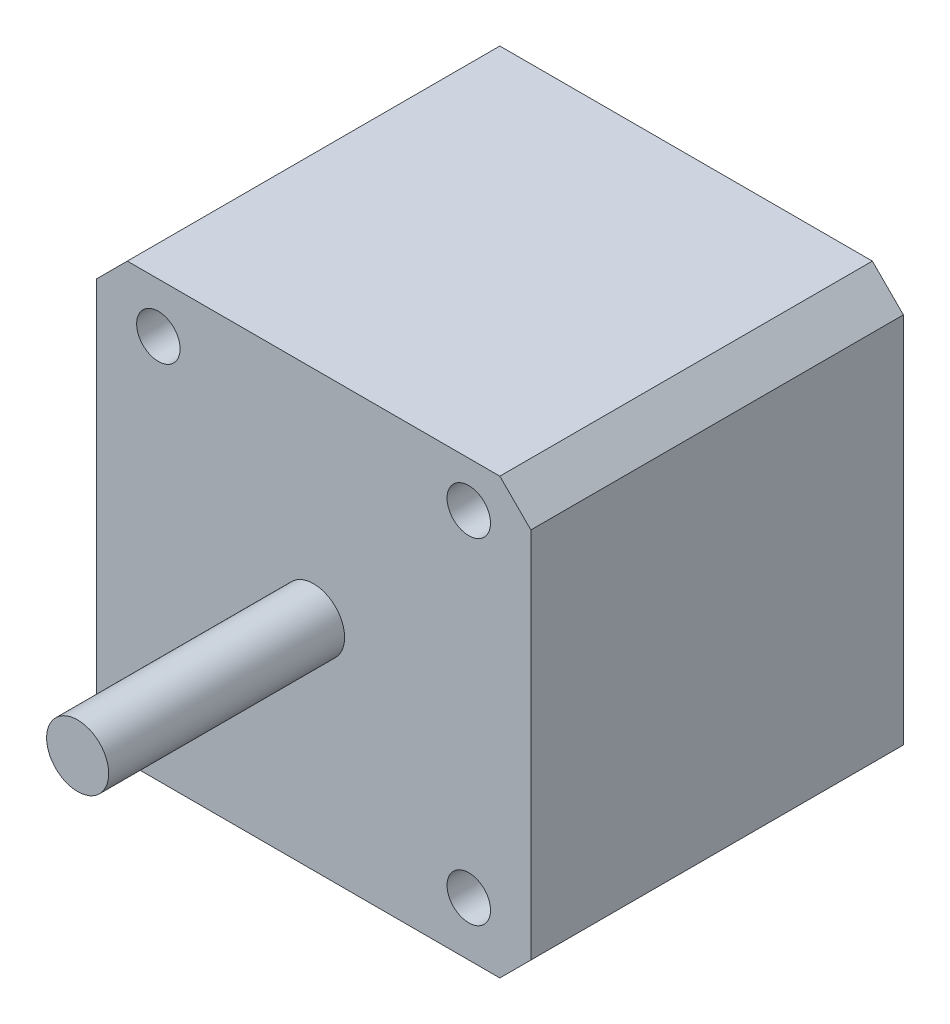
ISO-10303-21;
HEADER;
FILE_DESCRIPTION(('STEP AP214'),'2;1');
FILE_NAME('part.step','',(''),(''),'','','');
FILE_SCHEMA(('AUTOMOTIVE_DESIGN { 1 0 10303 214 1 1 1 1 }'));
ENDSEC;
DATA;
#1=APPLICATION_CONTEXT('core data for automotive mechanical design processes');
#2=APPLICATION_PROTOCOL_DEFINITION('international standard','automotive_design',2000,#1);
#3=PRODUCT_CONTEXT('',#1,'mechanical');
#4=PRODUCT('Part','Part','',(#3));
#5=PRODUCT_RELATED_PRODUCT_CATEGORY('part','',(#4));
#6=PRODUCT_DEFINITION_FORMATION('','',#4);
#7=PRODUCT_DEFINITION_CONTEXT('part definition',#1,'design');
#8=PRODUCT_DEFINITION('design','',#6,#7);
#9=PRODUCT_DEFINITION_SHAPE('','',#8);
#10=(LENGTH_UNIT() NAMED_UNIT(*) SI_UNIT(.MILLI.,.METRE.));
#11=(NAMED_UNIT(*) PLANE_ANGLE_UNIT() SI_UNIT($,.RADIAN.));
#12=(NAMED_UNIT(*) SI_UNIT($,.STERADIAN.) SOLID_ANGLE_UNIT());
#13=UNCERTAINTY_MEASURE_WITH_UNIT(LENGTH_MEASURE(1.E-05),#10,'distance_accuracy_value','');
#14=(GEOMETRIC_REPRESENTATION_CONTEXT(3) GLOBAL_UNCERTAINTY_ASSIGNED_CONTEXT((#13)) GLOBAL_UNIT_ASSIGNED_CONTEXT((#10,
#11,#12)) REPRESENTATION_CONTEXT('',''));
#15=CARTESIAN_POINT('',(0.,0.,0.));
#16=DIRECTION('',(0.,0.,1.));
#17=DIRECTION('',(1.,0.,0.));
#18=AXIS2_PLACEMENT_3D('',#15,#16,#17);
#19=CARTESIAN_POINT('',(17.5,17.5,49.));
#20=DIRECTION('',(0.,0.,1.));
#21=DIRECTION('',(1.,0.,0.));
#22=AXIS2_PLACEMENT_3D('',#19,#20,#21);
#23=PLANE('',#22);
#24=CARTESIAN_POINT('',(17.5,17.5,49.));
#25=DIRECTION('',(0.,0.,-1.));
#26=DIRECTION('',(-1.,0.,0.));
#27=AXIS2_PLACEMENT_3D('',#24,#25,#26);
#28=CIRCLE('',#27,2.5);
#29=CARTESIAN_POINT('',(15.,17.5,49.));
#30=VERTEX_POINT('',#29);
#31=EDGE_CURVE('E20',#30,#30,#28,.T.);
#32=ORIENTED_EDGE('',*,*,#31,.F.);
#33=EDGE_LOOP('',(#32));
#34=FACE_BOUND('',#33,.T.);
#35=ADVANCED_FACE('F17',(#34),#23,.T.);
#36=CARTESIAN_POINT('',(17.5,17.5,49.));
#37=DIRECTION('',(0.,0.,-1.));
#38=DIRECTION('',(-1.,0.,0.));
#39=AXIS2_PLACEMENT_3D('',#36,#37,#38);
#40=CYLINDRICAL_SURFACE('',#39,2.5);
#41=ORIENTED_EDGE('',*,*,#31,.T.);
#42=EDGE_LOOP('',(#41));
#43=FACE_BOUND('',#42,.T.);
#44=CARTESIAN_POINT('',(17.5,17.5,30.));
#45=DIRECTION('',(0.,0.,-1.));
#46=DIRECTION('',(-1.,0.,0.));
#47=AXIS2_PLACEMENT_3D('',#44,#45,#46);
#48=CIRCLE('',#47,2.5);
#49=CARTESIAN_POINT('',(15.,17.5,30.));
#50=VERTEX_POINT('',#49);
#51=EDGE_CURVE('E132',#50,#50,#48,.F.);
#52=ORIENTED_EDGE('',*,*,#51,.T.);
#53=EDGE_LOOP('',(#52));
#54=FACE_BOUND('',#53,.T.);
#55=ADVANCED_FACE('F139',(#43,#54),#40,.T.);
#56=CARTESIAN_POINT('',(0.,0.,30.));
#57=DIRECTION('',(0.,0.,-1.));
#58=DIRECTION('',(-1.,0.,0.));
#59=AXIS2_PLACEMENT_3D('',#56,#57,#58);
#60=PLANE('',#59);
#61=ORIENTED_EDGE('',*,*,#51,.F.);
#62=EDGE_LOOP('',(#61));
#63=FACE_BOUND('',#62,.T.);
#64=DIRECTION('',(-0.707106781186546,0.707106781186549,0.));
#65=VECTOR('',#64,1.);
#66=CARTESIAN_POINT('',(2.5,0.,30.));
#67=LINE('',#66,#65);
#68=CARTESIAN_POINT('',(0.,2.50000000000002,30.));
#69=VERTEX_POINT('',#68);
#70=CARTESIAN_POINT('',(2.5,0.,30.));
#71=VERTEX_POINT('',#70);
#72=EDGE_CURVE('E95',#69,#71,#67,.F.);
#73=ORIENTED_EDGE('',*,*,#72,.T.);
#74=DIRECTION('',(1.,0.,0.));
#75=VECTOR('',#74,1.);
#76=CARTESIAN_POINT('',(0.,0.,30.));
#77=LINE('',#76,#75);
#78=CARTESIAN_POINT('',(32.5,0.,30.));
#79=VERTEX_POINT('',#78);
#80=EDGE_CURVE('E84',#71,#79,#77,.T.);
#81=ORIENTED_EDGE('',*,*,#80,.T.);
#82=DIRECTION('',(-0.707106781186549,-0.707106781186546,0.));
#83=VECTOR('',#82,1.);
#84=CARTESIAN_POINT('',(35.,2.5,30.));
#85=LINE('',#84,#83);
#86=CARTESIAN_POINT('',(35.,2.50000000000001,30.));
#87=VERTEX_POINT('',#86);
#88=EDGE_CURVE('E121',#79,#87,#85,.F.);
#89=ORIENTED_EDGE('',*,*,#88,.T.);
#90=DIRECTION('',(0.,1.,0.));
#91=VECTOR('',#90,1.);
#92=CARTESIAN_POINT('',(35.,0.,30.));
#93=LINE('',#92,#91);
#94=CARTESIAN_POINT('',(35.,32.5,30.));
#95=VERTEX_POINT('',#94);
#96=EDGE_CURVE('E339',#87,#95,#93,.T.);
#97=ORIENTED_EDGE('',*,*,#96,.T.);
#98=DIRECTION('',(0.707106781186546,-0.707106781186549,0.));
#99=VECTOR('',#98,1.);
#100=CARTESIAN_POINT('',(32.5,35.,30.));
#101=LINE('',#100,#99);
#102=CARTESIAN_POINT('',(32.5,35.,30.));
#103=VERTEX_POINT('',#102);
#104=EDGE_CURVE('E334',#95,#103,#101,.F.);
#105=ORIENTED_EDGE('',*,*,#104,.T.);
#106=DIRECTION('',(1.,0.,0.));
#107=VECTOR('',#106,1.);
#108=CARTESIAN_POINT('',(0.,35.,30.));
#109=LINE('',#108,#107);
#110=CARTESIAN_POINT('',(2.50000000000002,35.,30.));
#111=VERTEX_POINT('',#110);
#112=EDGE_CURVE('E329',#103,#111,#109,.F.);
#113=ORIENTED_EDGE('',*,*,#112,.T.);
#114=DIRECTION('',(0.707106781186549,0.707106781186546,0.));
#115=VECTOR('',#114,1.);
#116=CARTESIAN_POINT('',(0.,32.5,30.));
#117=LINE('',#116,#115);
#118=CARTESIAN_POINT('',(0.,32.5,30.));
#119=VERTEX_POINT('',#118);
#120=EDGE_CURVE('E323',#111,#119,#117,.F.);
#121=ORIENTED_EDGE('',*,*,#120,.T.);
#122=DIRECTION('',(0.,1.,0.));
#123=VECTOR('',#122,1.);
#124=CARTESIAN_POINT('',(0.,0.,30.));
#125=LINE('',#124,#123);
#126=EDGE_CURVE('E79',#119,#69,#125,.F.);
#127=ORIENTED_EDGE('',*,*,#126,.T.);
#128=EDGE_LOOP('',(#73,#81,#89,#97,#105,#113,#121,#127));
#129=FACE_BOUND('',#128,.T.);
#130=CARTESIAN_POINT('',(4.99999999999999,4.,30.));
#131=DIRECTION('',(0.,0.,-1.));
#132=DIRECTION('',(-1.,0.,0.));
#133=AXIS2_PLACEMENT_3D('',#130,#131,#132);
#134=CIRCLE('',#133,1.75);
#135=CARTESIAN_POINT('',(3.24999999999999,4.,30.));
#136=VERTEX_POINT('',#135);
#137=EDGE_CURVE('E93',#136,#136,#134,.T.);
#138=ORIENTED_EDGE('',*,*,#137,.T.);
#139=EDGE_LOOP('',(#138));
#140=FACE_BOUND('',#139,.T.);
#141=CARTESIAN_POINT('',(30.,4.34590142974924,30.));
#142=DIRECTION('',(0.,0.,-1.));
#143=DIRECTION('',(-1.,0.,0.));
#144=AXIS2_PLACEMENT_3D('',#141,#142,#143);
#145=CIRCLE('',#144,1.75);
#146=CARTESIAN_POINT('',(28.25,4.34590142974924,30.));
#147=VERTEX_POINT('',#146);
#148=EDGE_CURVE('E124',#147,#147,#145,.T.);
#149=ORIENTED_EDGE('',*,*,#148,.T.);
#150=EDGE_LOOP('',(#149));
#151=FACE_BOUND('',#150,.T.);
#152=CARTESIAN_POINT('',(5.00000000000008,31.,30.));
#153=DIRECTION('',(0.,0.,-1.));
#154=DIRECTION('',(-1.,0.,0.));
#155=AXIS2_PLACEMENT_3D('',#152,#153,#154);
#156=CIRCLE('',#155,1.75);
#157=CARTESIAN_POINT('',(3.25000000000008,31.,30.));
#158=VERTEX_POINT('',#157);
#159=EDGE_CURVE('E127',#158,#158,#156,.T.);
#160=ORIENTED_EDGE('',*,*,#159,.T.);
#161=EDGE_LOOP('',(#160));
#162=FACE_BOUND('',#161,.T.);
#163=CARTESIAN_POINT('',(30.0000000000001,31.3459014297492,30.));
#164=DIRECTION('',(0.,0.,-1.));
#165=DIRECTION('',(-1.,0.,0.));
#166=AXIS2_PLACEMENT_3D('',#163,#164,#165);
#167=CIRCLE('',#166,1.75);
#168=CARTESIAN_POINT('',(28.2500000000001,31.3459014297492,30.));
#169=VERTEX_POINT('',#168);
#170=EDGE_CURVE('E130',#169,#169,#167,.T.);
#171=ORIENTED_EDGE('',*,*,#170,.T.);
#172=EDGE_LOOP('',(#171));
#173=FACE_BOUND('',#172,.T.);
#174=ADVANCED_FACE('F96',(#63,#129,#140,#151,#162,#173),#60,.F.);
#175=CARTESIAN_POINT('',(30.0000000000001,31.3459014297492,49.));
#176=DIRECTION('',(0.,0.,-1.));
#177=DIRECTION('',(-1.,0.,0.));
#178=AXIS2_PLACEMENT_3D('',#175,#176,#177);
#179=CYLINDRICAL_SURFACE('',#178,1.75);
#180=CARTESIAN_POINT('',(30.0000000000001,31.3459014297492,0.));
#181=DIRECTION('',(0.,0.,-1.));
#182=DIRECTION('',(-1.,0.,0.));
#183=AXIS2_PLACEMENT_3D('',#180,#181,#182);
#184=CIRCLE('',#183,1.75);
#185=CARTESIAN_POINT('',(28.2500000000001,31.3459014297492,0.));
#186=VERTEX_POINT('',#185);
#187=EDGE_CURVE('E118',#186,#186,#184,.F.);
#188=ORIENTED_EDGE('',*,*,#187,.F.);
#189=EDGE_LOOP('',(#188));
#190=FACE_BOUND('',#189,.T.);
#191=ORIENTED_EDGE('',*,*,#170,.F.);
#192=EDGE_LOOP('',(#191));
#193=FACE_BOUND('',#192,.T.);
#194=ADVANCED_FACE('F193',(#190,#193),#179,.F.);
#195=CARTESIAN_POINT('',(5.00000000000008,31.,49.));
#196=DIRECTION('',(0.,0.,-1.));
#197=DIRECTION('',(-1.,0.,0.));
#198=AXIS2_PLACEMENT_3D('',#195,#196,#197);
#199=CYLINDRICAL_SURFACE('',#198,1.75);
#200=CARTESIAN_POINT('',(5.00000000000008,31.,0.));
#201=DIRECTION('',(0.,0.,-1.));
#202=DIRECTION('',(-1.,0.,0.));
#203=AXIS2_PLACEMENT_3D('',#200,#201,#202);
#204=CIRCLE('',#203,1.75);
#205=CARTESIAN_POINT('',(3.25000000000008,31.,0.));
#206=VERTEX_POINT('',#205);
#207=EDGE_CURVE('E115',#206,#206,#204,.F.);
#208=ORIENTED_EDGE('',*,*,#207,.F.);
#209=EDGE_LOOP('',(#208));
#210=FACE_BOUND('',#209,.T.);
#211=ORIENTED_EDGE('',*,*,#159,.F.);
#212=EDGE_LOOP('',(#211));
#213=FACE_BOUND('',#212,.T.);
#214=ADVANCED_FACE('F189',(#210,#213),#199,.F.);
#215=CARTESIAN_POINT('',(30.,4.34590142974924,49.));
#216=DIRECTION('',(0.,0.,-1.));
#217=DIRECTION('',(-1.,0.,0.));
#218=AXIS2_PLACEMENT_3D('',#215,#216,#217);
#219=CYLINDRICAL_SURFACE('',#218,1.75);
#220=CARTESIAN_POINT('',(30.,4.34590142974924,0.));
#221=DIRECTION('',(0.,0.,-1.));
#222=DIRECTION('',(-1.,0.,0.));
#223=AXIS2_PLACEMENT_3D('',#220,#221,#222);
#224=CIRCLE('',#223,1.75);
#225=CARTESIAN_POINT('',(28.25,4.34590142974924,0.));
#226=VERTEX_POINT('',#225);
#227=EDGE_CURVE('E112',#226,#226,#224,.F.);
#228=ORIENTED_EDGE('',*,*,#227,.F.);
#229=EDGE_LOOP('',(#228));
#230=FACE_BOUND('',#229,.T.);
#231=ORIENTED_EDGE('',*,*,#148,.F.);
#232=EDGE_LOOP('',(#231));
#233=FACE_BOUND('',#232,.T.);
#234=ADVANCED_FACE('F185',(#230,#233),#219,.F.);
#235=CARTESIAN_POINT('',(4.99999999999999,4.,49.));
#236=DIRECTION('',(0.,0.,-1.));
#237=DIRECTION('',(-1.,0.,0.));
#238=AXIS2_PLACEMENT_3D('',#235,#236,#237);
#239=CYLINDRICAL_SURFACE('',#238,1.75);
#240=CARTESIAN_POINT('',(4.99999999999999,4.,0.));
#241=DIRECTION('',(0.,0.,-1.));
#242=DIRECTION('',(-1.,0.,0.));
#243=AXIS2_PLACEMENT_3D('',#240,#241,#242);
#244=CIRCLE('',#243,1.75);
#245=CARTESIAN_POINT('',(3.24999999999999,4.,0.));
#246=VERTEX_POINT('',#245);
#247=EDGE_CURVE('E108',#246,#246,#244,.F.);
#248=ORIENTED_EDGE('',*,*,#247,.F.);
#249=EDGE_LOOP('',(#248));
#250=FACE_BOUND('',#249,.T.);
#251=ORIENTED_EDGE('',*,*,#137,.F.);
#252=EDGE_LOOP('',(#251));
#253=FACE_BOUND('',#252,.T.);
#254=ADVANCED_FACE('F182',(#250,#253),#239,.F.);
#255=CARTESIAN_POINT('',(0.,0.,30.));
#256=DIRECTION('',(0.,1.,0.));
#257=DIRECTION('',(0.,0.,1.));
#258=AXIS2_PLACEMENT_3D('',#255,#256,#257);
#259=PLANE('',#258);
#260=DIRECTION('',(0.,0.,1.));
#261=VECTOR('',#260,1.);
#262=CARTESIAN_POINT('',(2.5,0.,30.));
#263=LINE('',#262,#261);
#264=CARTESIAN_POINT('',(2.5,0.,0.));
#265=VERTEX_POINT('',#264);
#266=EDGE_CURVE('E87',#71,#265,#263,.F.);
#267=ORIENTED_EDGE('',*,*,#266,.T.);
#268=DIRECTION('',(-1.,0.,0.));
#269=VECTOR('',#268,1.);
#270=CARTESIAN_POINT('',(0.,0.,0.));
#271=LINE('',#270,#269);
#272=CARTESIAN_POINT('',(32.5,0.,0.));
#273=VERTEX_POINT('',#272);
#274=EDGE_CURVE('E111',#273,#265,#271,.T.);
#275=ORIENTED_EDGE('',*,*,#274,.F.);
#276=DIRECTION('',(0.,0.,1.));
#277=VECTOR('',#276,1.);
#278=CARTESIAN_POINT('',(32.5,0.,30.));
#279=LINE('',#278,#277);
#280=EDGE_CURVE('E90',#273,#79,#279,.T.);
#281=ORIENTED_EDGE('',*,*,#280,.T.);
#282=ORIENTED_EDGE('',*,*,#80,.F.);
#283=EDGE_LOOP('',(#267,#275,#281,#282));
#284=FACE_BOUND('',#283,.T.);
#285=ADVANCED_FACE('F85',(#284),#259,.F.);
#286=CARTESIAN_POINT('',(2.5,0.,30.));
#287=DIRECTION('',(0.707106781186549,0.707106781186546,0.));
#288=DIRECTION('',(-0.707106781186546,0.707106781186549,0.));
#289=AXIS2_PLACEMENT_3D('',#286,#287,#288);
#290=PLANE('',#289);
#291=DIRECTION('',(0.,0.,-1.));
#292=VECTOR('',#291,1.);
#293=CARTESIAN_POINT('',(0.,2.50000000000002,30.));
#294=LINE('',#293,#292);
#295=CARTESIAN_POINT('',(0.,2.50000000000002,0.));
#296=VERTEX_POINT('',#295);
#297=EDGE_CURVE('E318',#69,#296,#294,.T.);
#298=ORIENTED_EDGE('',*,*,#297,.T.);
#299=DIRECTION('',(-0.707106781186546,0.707106781186549,0.));
#300=VECTOR('',#299,1.);
#301=CARTESIAN_POINT('',(2.5,0.,0.));
#302=LINE('',#301,#300);
#303=EDGE_CURVE('E103',#265,#296,#302,.T.);
#304=ORIENTED_EDGE('',*,*,#303,.F.);
#305=ORIENTED_EDGE('',*,*,#266,.F.);
#306=ORIENTED_EDGE('',*,*,#72,.F.);
#307=EDGE_LOOP('',(#298,#304,#305,#306));
#308=FACE_BOUND('',#307,.T.);
#309=ADVANCED_FACE('F101',(#308),#290,.F.);
#310=CARTESIAN_POINT('',(0.,0.,30.));
#311=DIRECTION('',(1.,0.,0.));
#312=DIRECTION('',(0.,0.,-1.));
#313=AXIS2_PLACEMENT_3D('',#310,#311,#312);
#314=PLANE('',#313);
#315=ORIENTED_EDGE('',*,*,#297,.F.);
#316=ORIENTED_EDGE('',*,*,#126,.F.);
#317=DIRECTION('',(0.,0.,1.));
#318=VECTOR('',#317,1.);
#319=CARTESIAN_POINT('',(0.,32.5,30.));
#320=LINE('',#319,#318);
#321=CARTESIAN_POINT('',(0.,32.5,0.));
#322=VERTEX_POINT('',#321);
#323=EDGE_CURVE('E321',#119,#322,#320,.F.);
#324=ORIENTED_EDGE('',*,*,#323,.T.);
#325=DIRECTION('',(0.,1.,0.));
#326=VECTOR('',#325,1.);
#327=CARTESIAN_POINT('',(0.,0.,0.));
#328=LINE('',#327,#326);
#329=EDGE_CURVE('E320',#296,#322,#328,.T.);
#330=ORIENTED_EDGE('',*,*,#329,.F.);
#331=EDGE_LOOP('',(#315,#316,#324,#330));
#332=FACE_BOUND('',#331,.T.);
#333=ADVANCED_FACE('F173',(#332),#314,.F.);
#334=CARTESIAN_POINT('',(0.,32.5,30.));
#335=DIRECTION('',(0.707106781186546,-0.707106781186549,0.));
#336=DIRECTION('',(0.707106781186549,0.707106781186546,0.));
#337=AXIS2_PLACEMENT_3D('',#334,#335,#336);
#338=PLANE('',#337);
#339=DIRECTION('',(0.,0.,-1.));
#340=VECTOR('',#339,1.);
#341=CARTESIAN_POINT('',(2.50000000000002,35.,30.));
#342=LINE('',#341,#340);
#343=CARTESIAN_POINT('',(2.50000000000002,35.,0.));
#344=VERTEX_POINT('',#343);
#345=EDGE_CURVE('E327',#111,#344,#342,.T.);
#346=ORIENTED_EDGE('',*,*,#345,.T.);
#347=DIRECTION('',(0.707106781186547,0.707106781186547,0.));
#348=VECTOR('',#347,1.);
#349=CARTESIAN_POINT('',(0.,32.5,0.));
#350=LINE('',#349,#348);
#351=EDGE_CURVE('E348',#322,#344,#350,.T.);
#352=ORIENTED_EDGE('',*,*,#351,.F.);
#353=ORIENTED_EDGE('',*,*,#323,.F.);
#354=ORIENTED_EDGE('',*,*,#120,.F.);
#355=EDGE_LOOP('',(#346,#352,#353,#354));
#356=FACE_BOUND('',#355,.T.);
#357=ADVANCED_FACE('F169',(#356),#338,.F.);
#358=CARTESIAN_POINT('',(0.,35.,30.));
#359=DIRECTION('',(0.,-1.,0.));
#360=DIRECTION('',(0.,0.,-1.));
#361=AXIS2_PLACEMENT_3D('',#358,#359,#360);
#362=PLANE('',#361);
#363=DIRECTION('',(0.,0.,1.));
#364=VECTOR('',#363,1.);
#365=CARTESIAN_POINT('',(32.5,35.,30.));
#366=LINE('',#365,#364);
#367=CARTESIAN_POINT('',(32.5,35.,0.));
#368=VERTEX_POINT('',#367);
#369=EDGE_CURVE('E332',#103,#368,#366,.F.);
#370=ORIENTED_EDGE('',*,*,#369,.T.);
#371=DIRECTION('',(-1.,0.,0.));
#372=VECTOR('',#371,1.);
#373=CARTESIAN_POINT('',(0.,35.,0.));
#374=LINE('',#373,#372);
#375=EDGE_CURVE('E351',#344,#368,#374,.F.);
#376=ORIENTED_EDGE('',*,*,#375,.F.);
#377=ORIENTED_EDGE('',*,*,#345,.F.);
#378=ORIENTED_EDGE('',*,*,#112,.F.);
#379=EDGE_LOOP('',(#370,#376,#377,#378));
#380=FACE_BOUND('',#379,.T.);
#381=ADVANCED_FACE('F165',(#380),#362,.F.);
#382=CARTESIAN_POINT('',(32.5,35.,30.));
#383=DIRECTION('',(-0.707106781186549,-0.707106781186546,0.));
#384=DIRECTION('',(0.707106781186546,-0.707106781186549,0.));
#385=AXIS2_PLACEMENT_3D('',#382,#383,#384);
#386=PLANE('',#385);
#387=DIRECTION('',(0.,0.,1.));
#388=VECTOR('',#387,1.);
#389=CARTESIAN_POINT('',(35.,32.5,30.));
#390=LINE('',#389,#388);
#391=CARTESIAN_POINT('',(35.,32.5,0.));
#392=VERTEX_POINT('',#391);
#393=EDGE_CURVE('E337',#95,#392,#390,.F.);
#394=ORIENTED_EDGE('',*,*,#393,.T.);
#395=DIRECTION('',(0.707106781186547,-0.707106781186547,0.));
#396=VECTOR('',#395,1.);
#397=CARTESIAN_POINT('',(32.5,35.,0.));
#398=LINE('',#397,#396);
#399=EDGE_CURVE('E354',#368,#392,#398,.T.);
#400=ORIENTED_EDGE('',*,*,#399,.F.);
#401=ORIENTED_EDGE('',*,*,#369,.F.);
#402=ORIENTED_EDGE('',*,*,#104,.F.);
#403=EDGE_LOOP('',(#394,#400,#401,#402));
#404=FACE_BOUND('',#403,.T.);
#405=ADVANCED_FACE('F162',(#404),#386,.F.);
#406=CARTESIAN_POINT('',(35.,0.,30.));
#407=DIRECTION('',(-1.,0.,0.));
#408=DIRECTION('',(0.,0.,1.));
#409=AXIS2_PLACEMENT_3D('',#406,#407,#408);
#410=PLANE('',#409);
#411=DIRECTION('',(0.,0.,1.));
#412=VECTOR('',#411,1.);
#413=CARTESIAN_POINT('',(35.,2.5,30.));
#414=LINE('',#413,#412);
#415=CARTESIAN_POINT('',(35.,2.50000000000001,0.));
#416=VERTEX_POINT('',#415);
#417=EDGE_CURVE('E35',#87,#416,#414,.F.);
#418=ORIENTED_EDGE('',*,*,#417,.T.);
#419=DIRECTION('',(0.,1.,0.));
#420=VECTOR('',#419,1.);
#421=CARTESIAN_POINT('',(35.,0.,0.));
#422=LINE('',#421,#420);
#423=EDGE_CURVE('E26',#392,#416,#422,.F.);
#424=ORIENTED_EDGE('',*,*,#423,.F.);
#425=ORIENTED_EDGE('',*,*,#393,.F.);
#426=ORIENTED_EDGE('',*,*,#96,.F.);
#427=EDGE_LOOP('',(#418,#424,#425,#426));
#428=FACE_BOUND('',#427,.T.);
#429=ADVANCED_FACE('F154',(#428),#410,.F.);
#430=CARTESIAN_POINT('',(35.,2.5,30.));
#431=DIRECTION('',(-0.707106781186546,0.707106781186549,0.));
#432=DIRECTION('',(-0.707106781186549,-0.707106781186546,0.));
#433=AXIS2_PLACEMENT_3D('',#430,#431,#432);
#434=PLANE('',#433);
#435=ORIENTED_EDGE('',*,*,#280,.F.);
#436=DIRECTION('',(-0.707106781186548,-0.707106781186547,0.));
#437=VECTOR('',#436,1.);
#438=CARTESIAN_POINT('',(35.,2.50000000000001,0.));
#439=LINE('',#438,#437);
#440=EDGE_CURVE('E11',#416,#273,#439,.T.);
#441=ORIENTED_EDGE('',*,*,#440,.F.);
#442=ORIENTED_EDGE('',*,*,#417,.F.);
#443=ORIENTED_EDGE('',*,*,#88,.F.);
#444=EDGE_LOOP('',(#435,#441,#442,#443));
#445=FACE_BOUND('',#444,.T.);
#446=ADVANCED_FACE('F148',(#445),#434,.F.);
#447=CARTESIAN_POINT('',(0.,0.,0.));
#448=DIRECTION('',(0.,0.,-1.));
#449=DIRECTION('',(-1.,0.,0.));
#450=AXIS2_PLACEMENT_3D('',#447,#448,#449);
#451=PLANE('',#450);
#452=ORIENTED_EDGE('',*,*,#423,.T.);
#453=ORIENTED_EDGE('',*,*,#440,.T.);
#454=ORIENTED_EDGE('',*,*,#274,.T.);
#455=ORIENTED_EDGE('',*,*,#303,.T.);
#456=ORIENTED_EDGE('',*,*,#329,.T.);
#457=ORIENTED_EDGE('',*,*,#351,.T.);
#458=ORIENTED_EDGE('',*,*,#375,.T.);
#459=ORIENTED_EDGE('',*,*,#399,.T.);
#460=EDGE_LOOP('',(#452,#453,#454,#455,#456,#457,#458,#459));
#461=FACE_BOUND('',#460,.T.);
#462=ORIENTED_EDGE('',*,*,#247,.T.);
#463=EDGE_LOOP('',(#462));
#464=FACE_BOUND('',#463,.T.);
#465=ORIENTED_EDGE('',*,*,#227,.T.);
#466=EDGE_LOOP('',(#465));
#467=FACE_BOUND('',#466,.T.);
#468=ORIENTED_EDGE('',*,*,#207,.T.);
#469=EDGE_LOOP('',(#468));
#470=FACE_BOUND('',#469,.T.);
#471=ORIENTED_EDGE('',*,*,#187,.T.);
#472=EDGE_LOOP('',(#471));
#473=FACE_BOUND('',#472,.T.);
#474=ADVANCED_FACE('F146',(#461,#464,#467,#470,#473),#451,.T.);
#475=CLOSED_SHELL('',(#35,#55,#174,#194,#214,#234,#254,#285,#309,#333,#357,#381,#405,#429,#446,#474));
#476=MANIFOLD_SOLID_BREP('B1',#475);
#477=ADVANCED_BREP_SHAPE_REPRESENTATION('',(#18,#476),#14);
#478=SHAPE_DEFINITION_REPRESENTATION(#9,#477);
ENDSEC;
END-ISO-10303-21;
